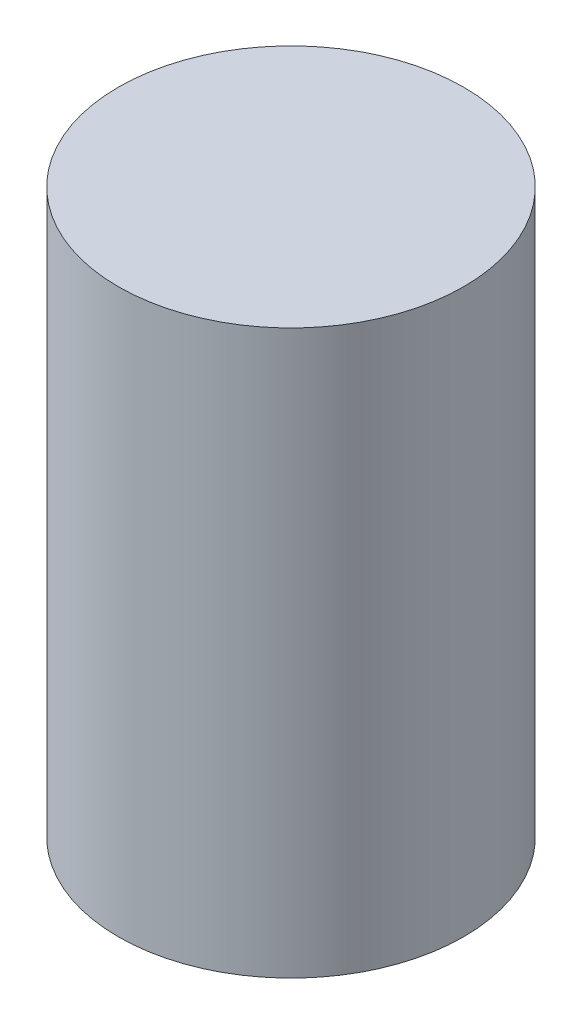
ISO-10303-21;
HEADER;
FILE_DESCRIPTION(('STEP AP214'),'2;1');
FILE_NAME('part.step','',(''),(''),'','','');
FILE_SCHEMA(('AUTOMOTIVE_DESIGN { 1 0 10303 214 1 1 1 1 }'));
ENDSEC;
DATA;
#1=APPLICATION_CONTEXT('core data for automotive mechanical design processes');
#2=APPLICATION_PROTOCOL_DEFINITION('international standard','automotive_design',2000,#1);
#3=PRODUCT_CONTEXT('',#1,'mechanical');
#4=PRODUCT('Part','Part','',(#3));
#5=PRODUCT_RELATED_PRODUCT_CATEGORY('part','',(#4));
#6=PRODUCT_DEFINITION_FORMATION('','',#4);
#7=PRODUCT_DEFINITION_CONTEXT('part definition',#1,'design');
#8=PRODUCT_DEFINITION('design','',#6,#7);
#9=PRODUCT_DEFINITION_SHAPE('','',#8);
#10=(LENGTH_UNIT() NAMED_UNIT(*) SI_UNIT(.MILLI.,.METRE.));
#11=(NAMED_UNIT(*) PLANE_ANGLE_UNIT() SI_UNIT($,.RADIAN.));
#12=(NAMED_UNIT(*) SI_UNIT($,.STERADIAN.) SOLID_ANGLE_UNIT());
#13=UNCERTAINTY_MEASURE_WITH_UNIT(LENGTH_MEASURE(1.E-05),#10,'distance_accuracy_value','');
#14=(GEOMETRIC_REPRESENTATION_CONTEXT(3) GLOBAL_UNCERTAINTY_ASSIGNED_CONTEXT((#13)) GLOBAL_UNIT_ASSIGNED_CONTEXT((#10,
#11,#12)) REPRESENTATION_CONTEXT('',''));
#15=CARTESIAN_POINT('',(0.,0.,0.));
#16=DIRECTION('',(0.,0.,1.));
#17=DIRECTION('',(1.,0.,0.));
#18=AXIS2_PLACEMENT_3D('',#15,#16,#17);
#19=CARTESIAN_POINT('',(0.,279.4,0.));
#20=DIRECTION('',(0.,-1.,0.));
#21=DIRECTION('',(0.,0.,-1.));
#22=AXIS2_PLACEMENT_3D('',#19,#20,#21);
#23=CYLINDRICAL_SURFACE('',#22,85.7250000000001);
#24=CARTESIAN_POINT('',(0.,279.4,0.));
#25=DIRECTION('',(0.,1.,0.));
#26=DIRECTION('',(0.,0.,1.));
#27=AXIS2_PLACEMENT_3D('',#24,#25,#26);
#28=CIRCLE('',#27,85.7250000000001);
#29=CARTESIAN_POINT('',(0.,279.4,85.7250000000001));
#30=VERTEX_POINT('',#29);
#31=EDGE_CURVE('E10',#30,#30,#28,.T.);
#32=ORIENTED_EDGE('',*,*,#31,.F.);
#33=EDGE_LOOP('',(#32));
#34=FACE_BOUND('',#33,.T.);
#35=CARTESIAN_POINT('',(0.,0.,0.));
#36=DIRECTION('',(0.,1.,0.));
#37=DIRECTION('',(0.,0.,1.));
#38=AXIS2_PLACEMENT_3D('',#35,#36,#37);
#39=CIRCLE('',#38,85.7250000000001);
#40=CARTESIAN_POINT('',(0.,0.,85.7250000000001));
#41=VERTEX_POINT('',#40);
#42=EDGE_CURVE('E38',#41,#41,#39,.T.);
#43=ORIENTED_EDGE('',*,*,#42,.T.);
#44=EDGE_LOOP('',(#43));
#45=FACE_BOUND('',#44,.T.);
#46=ADVANCED_FACE('F35',(#34,#45),#23,.T.);
#47=CARTESIAN_POINT('',(0.,279.4,0.));
#48=DIRECTION('',(0.,1.,0.));
#49=DIRECTION('',(0.,0.,1.));
#50=AXIS2_PLACEMENT_3D('',#47,#48,#49);
#51=PLANE('',#50);
#52=ORIENTED_EDGE('',*,*,#31,.T.);
#53=EDGE_LOOP('',(#52));
#54=FACE_BOUND('',#53,.T.);
#55=ADVANCED_FACE('F50',(#54),#51,.T.);
#56=CARTESIAN_POINT('',(0.,0.,0.));
#57=DIRECTION('',(0.,1.,0.));
#58=DIRECTION('',(0.,0.,1.));
#59=AXIS2_PLACEMENT_3D('',#56,#57,#58);
#60=PLANE('',#59);
#61=ORIENTED_EDGE('',*,*,#42,.F.);
#62=EDGE_LOOP('',(#61));
#63=FACE_BOUND('',#62,.T.);
#64=ADVANCED_FACE('F48',(#63),#60,.F.);
#65=CLOSED_SHELL('',(#46,#55,#64));
#66=MANIFOLD_SOLID_BREP('B2',#65);
#67=ADVANCED_BREP_SHAPE_REPRESENTATION('',(#18,#66),#14);
#68=SHAPE_DEFINITION_REPRESENTATION(#9,#67);
ENDSEC;
END-ISO-10303-21;
